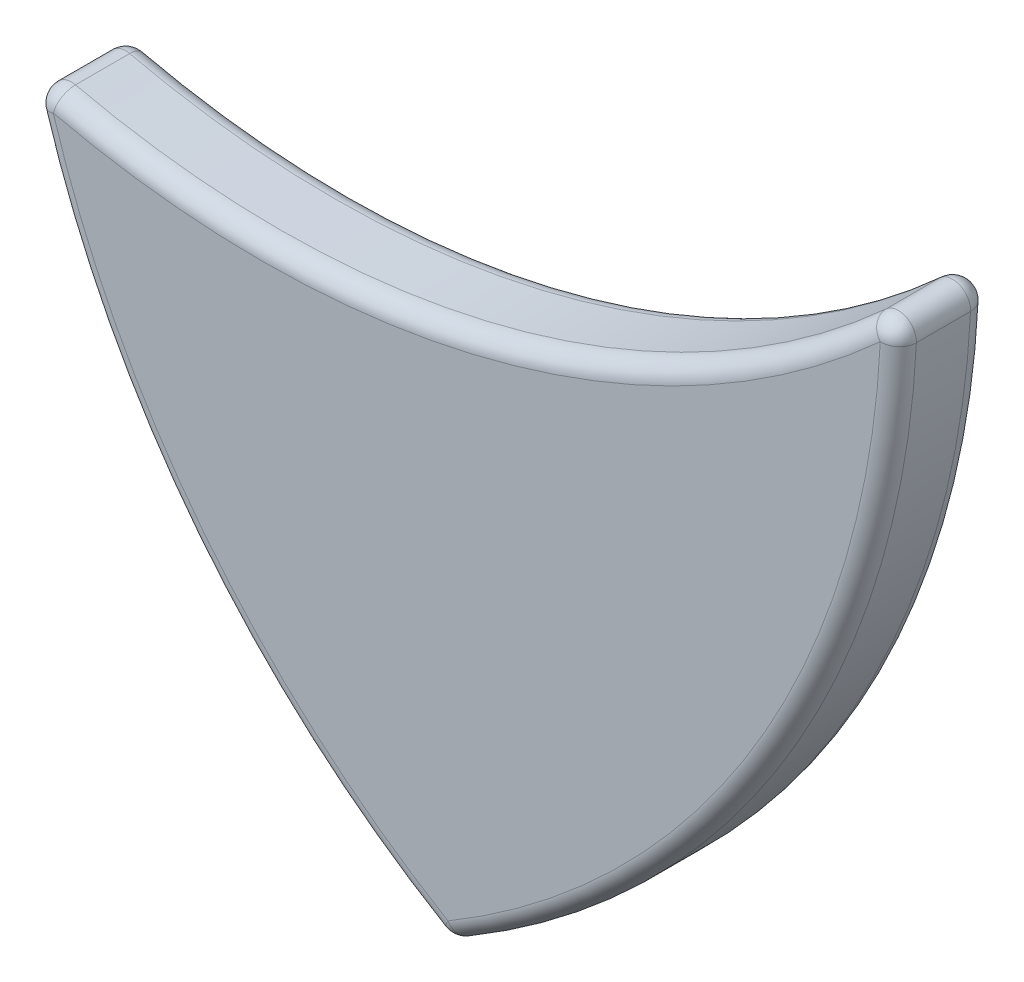
ISO-10303-21;
HEADER;
FILE_DESCRIPTION(('STEP AP214'),'2;1');
FILE_NAME('part.step','',(''),(''),'','','');
FILE_SCHEMA(('AUTOMOTIVE_DESIGN { 1 0 10303 214 1 1 1 1 }'));
ENDSEC;
DATA;
#1=APPLICATION_CONTEXT('core data for automotive mechanical design processes');
#2=APPLICATION_PROTOCOL_DEFINITION('international standard','automotive_design',2000,#1);
#3=PRODUCT_CONTEXT('',#1,'mechanical');
#4=PRODUCT('Part','Part','',(#3));
#5=PRODUCT_RELATED_PRODUCT_CATEGORY('part','',(#4));
#6=PRODUCT_DEFINITION_FORMATION('','',#4);
#7=PRODUCT_DEFINITION_CONTEXT('part definition',#1,'design');
#8=PRODUCT_DEFINITION('design','',#6,#7);
#9=PRODUCT_DEFINITION_SHAPE('','',#8);
#10=(LENGTH_UNIT() NAMED_UNIT(*) SI_UNIT(.MILLI.,.METRE.));
#11=(NAMED_UNIT(*) PLANE_ANGLE_UNIT() SI_UNIT($,.RADIAN.));
#12=(NAMED_UNIT(*) SI_UNIT($,.STERADIAN.) SOLID_ANGLE_UNIT());
#13=UNCERTAINTY_MEASURE_WITH_UNIT(LENGTH_MEASURE(1.E-05),#10,'distance_accuracy_value','');
#14=(GEOMETRIC_REPRESENTATION_CONTEXT(3) GLOBAL_UNCERTAINTY_ASSIGNED_CONTEXT((#13)) GLOBAL_UNIT_ASSIGNED_CONTEXT((#10,
#11,#12)) REPRESENTATION_CONTEXT('',''));
#15=CARTESIAN_POINT('',(0.,0.,0.));
#16=DIRECTION('',(0.,0.,1.));
#17=DIRECTION('',(1.,0.,0.));
#18=AXIS2_PLACEMENT_3D('',#15,#16,#17);
#19=CARTESIAN_POINT('',(-50.,0.,5.));
#20=DIRECTION('',(0.,0.,-1.));
#21=DIRECTION('',(-1.,0.,0.));
#22=AXIS2_PLACEMENT_3D('',#19,#20,#21);
#23=CYLINDRICAL_SURFACE('',#22,50.);
#24=DIRECTION('',(0.,0.,-1.));
#25=VECTOR('',#24,1.);
#26=CARTESIAN_POINT('',(-24.4897959183674,-43.0026683789908,5.));
#27=LINE('',#26,#25);
#28=CARTESIAN_POINT('',(-24.4897959183674,-43.0026683789908,4.));
#29=VERTEX_POINT('',#28);
#30=CARTESIAN_POINT('',(-24.4897959183674,-43.0026683789908,1.));
#31=VERTEX_POINT('',#30);
#32=EDGE_CURVE('E181',#29,#31,#27,.T.);
#33=ORIENTED_EDGE('',*,*,#32,.T.);
#34=CARTESIAN_POINT('',(-50.,0.,1.));
#35=DIRECTION('',(0.,0.,1.));
#36=DIRECTION('',(1.,0.,0.));
#37=AXIS2_PLACEMENT_3D('',#34,#35,#36);
#38=CIRCLE('',#37,50.);
#39=CARTESIAN_POINT('',(-0.0595144129420885,-2.43883154991504,1.));
#40=VERTEX_POINT('',#39);
#41=EDGE_CURVE('E184',#31,#40,#38,.T.);
#42=ORIENTED_EDGE('',*,*,#41,.T.);
#43=DIRECTION('',(0.,0.,-1.));
#44=VECTOR('',#43,1.);
#45=CARTESIAN_POINT('',(-0.0595144129420799,-2.43883154991504,5.));
#46=LINE('',#45,#44);
#47=CARTESIAN_POINT('',(-0.0595144129420885,-2.43883154991504,4.));
#48=VERTEX_POINT('',#47);
#49=EDGE_CURVE('E185',#40,#48,#46,.F.);
#50=ORIENTED_EDGE('',*,*,#49,.T.);
#51=CARTESIAN_POINT('',(-50.,0.,4.));
#52=DIRECTION('',(0.,0.,1.));
#53=DIRECTION('',(1.,0.,0.));
#54=AXIS2_PLACEMENT_3D('',#51,#52,#53);
#55=CIRCLE('',#54,50.);
#56=EDGE_CURVE('E174',#48,#29,#55,.F.);
#57=ORIENTED_EDGE('',*,*,#56,.T.);
#58=EDGE_LOOP('',(#33,#42,#50,#57));
#59=FACE_BOUND('',#58,.T.);
#60=ADVANCED_FACE('F37',(#59),#23,.T.);
#61=CARTESIAN_POINT('',(-35.3553390593375,35.3553390593173,5.));
#62=DIRECTION('',(0.,0.,-1.));
#63=DIRECTION('',(-1.,0.,0.));
#64=AXIS2_PLACEMENT_3D('',#61,#62,#63);
#65=CYLINDRICAL_SURFACE('',#64,50.);
#66=DIRECTION('',(0.,0.,-1.));
#67=VECTOR('',#66,1.);
#68=CARTESIAN_POINT('',(-1.73081461359804,-1.64994915463765,5.));
#69=LINE('',#68,#67);
#70=CARTESIAN_POINT('',(-1.73081461359804,-1.64994915463765,4.));
#71=VERTEX_POINT('',#70);
#72=CARTESIAN_POINT('',(-1.73081461359804,-1.64994915463765,1.));
#73=VERTEX_POINT('',#72);
#74=EDGE_CURVE('E116',#71,#73,#69,.T.);
#75=ORIENTED_EDGE('',*,*,#74,.T.);
#76=CARTESIAN_POINT('',(-35.3553390593375,35.3553390593173,1.));
#77=DIRECTION('',(0.,0.,1.));
#78=DIRECTION('',(1.,0.,0.));
#79=AXIS2_PLACEMENT_3D('',#76,#77,#78);
#80=CIRCLE('',#79,50.);
#81=CARTESIAN_POINT('',(-46.632039049049,-13.356425816758,1.));
#82=VERTEX_POINT('',#81);
#83=EDGE_CURVE('E112',#73,#82,#80,.F.);
#84=ORIENTED_EDGE('',*,*,#83,.T.);
#85=DIRECTION('',(0.,0.,-1.));
#86=VECTOR('',#85,1.);
#87=CARTESIAN_POINT('',(-46.632039049049,-13.356425816758,5.));
#88=LINE('',#87,#86);
#89=CARTESIAN_POINT('',(-46.632039049049,-13.356425816758,4.));
#90=VERTEX_POINT('',#89);
#91=EDGE_CURVE('E106',#82,#90,#88,.F.);
#92=ORIENTED_EDGE('',*,*,#91,.T.);
#93=CARTESIAN_POINT('',(-35.3553390593375,35.3553390593173,4.));
#94=DIRECTION('',(0.,0.,1.));
#95=DIRECTION('',(1.,0.,0.));
#96=AXIS2_PLACEMENT_3D('',#93,#94,#95);
#97=CIRCLE('',#96,50.);
#98=EDGE_CURVE('E109',#90,#71,#97,.T.);
#99=ORIENTED_EDGE('',*,*,#98,.T.);
#100=EDGE_LOOP('',(#75,#84,#92,#99));
#101=FACE_BOUND('',#100,.T.);
#102=ADVANCED_FACE('F108',(#101),#65,.F.);
#103=CARTESIAN_POINT('',(0.,0.,5.));
#104=DIRECTION('',(0.,0.,-1.));
#105=DIRECTION('',(-1.,0.,0.));
#106=AXIS2_PLACEMENT_3D('',#103,#104,#105);
#107=CYLINDRICAL_SURFACE('',#106,50.);
#108=CARTESIAN_POINT('',(0.,0.,4.));
#109=DIRECTION('',(0.,0.,1.));
#110=DIRECTION('',(1.,0.,0.));
#111=AXIS2_PLACEMENT_3D('',#108,#109,#110);
#112=CIRCLE('',#111,50.);
#113=CARTESIAN_POINT('',(-25.5102040816327,-43.0026683789908,4.));
#114=VERTEX_POINT('',#113);
#115=CARTESIAN_POINT('',(-47.81385004984,-14.6231235859995,4.));
#116=VERTEX_POINT('',#115);
#117=EDGE_CURVE('E227',#114,#116,#112,.F.);
#118=ORIENTED_EDGE('',*,*,#117,.T.);
#119=DIRECTION('',(0.,0.,-1.));
#120=VECTOR('',#119,1.);
#121=CARTESIAN_POINT('',(-47.8138500498401,-14.6231235859995,5.));
#122=LINE('',#121,#120);
#123=CARTESIAN_POINT('',(-47.81385004984,-14.6231235859995,1.));
#124=VERTEX_POINT('',#123);
#125=EDGE_CURVE('E138',#116,#124,#122,.T.);
#126=ORIENTED_EDGE('',*,*,#125,.T.);
#127=CARTESIAN_POINT('',(0.,0.,1.));
#128=DIRECTION('',(0.,0.,1.));
#129=DIRECTION('',(1.,0.,0.));
#130=AXIS2_PLACEMENT_3D('',#127,#128,#129);
#131=CIRCLE('',#130,50.);
#132=CARTESIAN_POINT('',(-25.5102040816327,-43.0026683789908,1.));
#133=VERTEX_POINT('',#132);
#134=EDGE_CURVE('E234',#124,#133,#131,.T.);
#135=ORIENTED_EDGE('',*,*,#134,.T.);
#136=DIRECTION('',(0.,0.,-1.));
#137=VECTOR('',#136,1.);
#138=CARTESIAN_POINT('',(-25.5102040816327,-43.0026683789908,5.));
#139=LINE('',#138,#137);
#140=EDGE_CURVE('E229',#133,#114,#139,.F.);
#141=ORIENTED_EDGE('',*,*,#140,.T.);
#142=EDGE_LOOP('',(#118,#126,#135,#141));
#143=FACE_BOUND('',#142,.T.);
#144=ADVANCED_FACE('F257',(#143),#107,.T.);
#145=CARTESIAN_POINT('',(-42.6776695296688,17.6776695296586,5.));
#146=DIRECTION('',(0.,0.,1.));
#147=DIRECTION('',(1.,0.,0.));
#148=AXIS2_PLACEMENT_3D('',#145,#146,#147);
#149=PLANE('',#148);
#150=CARTESIAN_POINT('',(-35.3553390593375,35.3553390593173,5.));
#151=DIRECTION('',(0.,0.,1.));
#152=DIRECTION('',(1.,0.,0.));
#153=AXIS2_PLACEMENT_3D('',#150,#151,#152);
#154=CIRCLE('',#153,51.);
#155=CARTESIAN_POINT('',(-1.05832412468324,-2.39005491891674,5.));
#156=VERTEX_POINT('',#155);
#157=CARTESIAN_POINT('',(-46.8575730488433,-14.3306611142795,5.));
#158=VERTEX_POINT('',#157);
#159=EDGE_CURVE('E46',#156,#158,#154,.F.);
#160=ORIENTED_EDGE('',*,*,#159,.T.);
#161=CARTESIAN_POINT('',(0.,0.,5.));
#162=DIRECTION('',(0.,0.,1.));
#163=DIRECTION('',(1.,0.,0.));
#164=AXIS2_PLACEMENT_3D('',#161,#162,#163);
#165=CIRCLE('',#164,49.);
#166=CARTESIAN_POINT('',(-25.,-42.142615011411,5.));
#167=VERTEX_POINT('',#166);
#168=EDGE_CURVE('E11',#158,#167,#165,.T.);
#169=ORIENTED_EDGE('',*,*,#168,.T.);
#170=CARTESIAN_POINT('',(-50.,0.,5.));
#171=DIRECTION('',(0.,0.,1.));
#172=DIRECTION('',(1.,0.,0.));
#173=AXIS2_PLACEMENT_3D('',#170,#171,#172);
#174=CIRCLE('',#173,49.);
#175=EDGE_CURVE('E56',#167,#156,#174,.T.);
#176=ORIENTED_EDGE('',*,*,#175,.T.);
#177=EDGE_LOOP('',(#160,#169,#176));
#178=FACE_BOUND('',#177,.T.);
#179=ADVANCED_FACE('F288',(#178),#149,.T.);
#180=CARTESIAN_POINT('',(-42.6776695296688,17.6776695296586,0.));
#181=DIRECTION('',(0.,0.,1.));
#182=DIRECTION('',(1.,0.,0.));
#183=AXIS2_PLACEMENT_3D('',#180,#181,#182);
#184=PLANE('',#183);
#185=CARTESIAN_POINT('',(0.,0.,0.));
#186=DIRECTION('',(0.,0.,1.));
#187=DIRECTION('',(1.,0.,0.));
#188=AXIS2_PLACEMENT_3D('',#185,#186,#187);
#189=CIRCLE('',#188,49.);
#190=CARTESIAN_POINT('',(-25.,-42.142615011411,0.));
#191=VERTEX_POINT('',#190);
#192=CARTESIAN_POINT('',(-46.8575730488433,-14.3306611142795,0.));
#193=VERTEX_POINT('',#192);
#194=EDGE_CURVE('E218',#191,#193,#189,.F.);
#195=ORIENTED_EDGE('',*,*,#194,.T.);
#196=CARTESIAN_POINT('',(-35.3553390593375,35.3553390593173,0.));
#197=DIRECTION('',(0.,0.,1.));
#198=DIRECTION('',(1.,0.,0.));
#199=AXIS2_PLACEMENT_3D('',#196,#197,#198);
#200=CIRCLE('',#199,51.);
#201=CARTESIAN_POINT('',(-1.05832412468324,-2.39005491891674,0.));
#202=VERTEX_POINT('',#201);
#203=EDGE_CURVE('E221',#193,#202,#200,.T.);
#204=ORIENTED_EDGE('',*,*,#203,.T.);
#205=CARTESIAN_POINT('',(-50.,0.,0.));
#206=DIRECTION('',(0.,0.,1.));
#207=DIRECTION('',(1.,0.,0.));
#208=AXIS2_PLACEMENT_3D('',#205,#206,#207);
#209=CIRCLE('',#208,49.);
#210=EDGE_CURVE('E212',#202,#191,#209,.F.);
#211=ORIENTED_EDGE('',*,*,#210,.T.);
#212=EDGE_LOOP('',(#195,#204,#211));
#213=FACE_BOUND('',#212,.T.);
#214=ADVANCED_FACE('F222',(#213),#184,.F.);
#215=CARTESIAN_POINT('',(-25.,-42.142615011411,4.));
#216=DIRECTION('',(0.,0.,1.));
#217=DIRECTION('',(1.,0.,0.));
#218=AXIS2_PLACEMENT_3D('',#215,#216,#217);
#219=SPHERICAL_SURFACE('',#218,1.);
#220=CARTESIAN_POINT('',(-25.,-42.142615011411,4.));
#221=DIRECTION('',(0.,0.,1.));
#222=DIRECTION('',(1.,0.,0.));
#223=AXIS2_PLACEMENT_3D('',#220,#221,#222);
#224=CIRCLE('',#223,1.);
#225=EDGE_CURVE('E160',#29,#114,#224,.F.);
#226=ORIENTED_EDGE('',*,*,#225,.F.);
#227=CARTESIAN_POINT('',(-25.,-42.142615011411,4.));
#228=DIRECTION('',(-0.860053367579815,-0.510204081632653,0.));
#229=DIRECTION('',(0.510204081632653,-0.860053367579815,0.));
#230=AXIS2_PLACEMENT_3D('',#227,#228,#229);
#231=CIRCLE('',#230,1.);
#232=EDGE_CURVE('E41',#167,#29,#231,.F.);
#233=ORIENTED_EDGE('',*,*,#232,.F.);
#234=CARTESIAN_POINT('',(-25.,-42.142615011411,4.));
#235=DIRECTION('',(0.860053367579815,-0.510204081632653,0.));
#236=DIRECTION('',(0.510204081632653,0.860053367579815,0.));
#237=AXIS2_PLACEMENT_3D('',#234,#235,#236);
#238=CIRCLE('',#237,1.);
#239=EDGE_CURVE('E162',#114,#167,#238,.F.);
#240=ORIENTED_EDGE('',*,*,#239,.F.);
#241=EDGE_LOOP('',(#226,#233,#240));
#242=FACE_BOUND('',#241,.T.);
#243=ADVANCED_FACE('F39',(#242),#219,.T.);
#244=CARTESIAN_POINT('',(-50.,0.,4.));
#245=DIRECTION('',(0.,0.,1.));
#246=DIRECTION('',(1.,0.,0.));
#247=AXIS2_PLACEMENT_3D('',#244,#245,#246);
#248=TOROIDAL_SURFACE('',#247,49.,1.);
#249=ORIENTED_EDGE('',*,*,#232,.T.);
#250=ORIENTED_EDGE('',*,*,#56,.F.);
#251=CARTESIAN_POINT('',(-1.05832412468324,-2.39005491891674,4.));
#252=DIRECTION('',(0.0487766309983015,0.998809711741158,0.));
#253=DIRECTION('',(-0.998809711741158,0.0487766309983015,0.));
#254=AXIS2_PLACEMENT_3D('',#251,#252,#253);
#255=CIRCLE('',#254,1.);
#256=EDGE_CURVE('E157',#156,#48,#255,.T.);
#257=ORIENTED_EDGE('',*,*,#256,.F.);
#258=ORIENTED_EDGE('',*,*,#175,.F.);
#259=EDGE_LOOP('',(#249,#250,#257,#258));
#260=FACE_BOUND('',#259,.T.);
#261=ADVANCED_FACE('F172',(#260),#248,.T.);
#262=CARTESIAN_POINT('',(-35.3553390593375,35.3553390593173,4.));
#263=DIRECTION('',(0.,0.,1.));
#264=DIRECTION('',(1.,0.,0.));
#265=AXIS2_PLACEMENT_3D('',#262,#263,#264);
#266=TOROIDAL_SURFACE('',#265,51.,1.);
#267=CARTESIAN_POINT('',(-46.8575730488433,-14.3306611142795,4.));
#268=DIRECTION('',(-0.974235297521503,0.22553399979424,0.));
#269=DIRECTION('',(-0.22553399979424,-0.974235297521503,0.));
#270=AXIS2_PLACEMENT_3D('',#267,#268,#269);
#271=CIRCLE('',#270,1.);
#272=EDGE_CURVE('E122',#158,#90,#271,.T.);
#273=ORIENTED_EDGE('',*,*,#272,.F.);
#274=ORIENTED_EDGE('',*,*,#159,.F.);
#275=CARTESIAN_POINT('',(-1.05832412468326,-2.39005491891674,4.));
#276=DIRECTION('',(0.740105764279098,0.672490488914789,0.));
#277=DIRECTION('',(-0.672490488914789,0.740105764279098,0.));
#278=AXIS2_PLACEMENT_3D('',#275,#276,#277);
#279=CIRCLE('',#278,1.);
#280=EDGE_CURVE('E125',#71,#156,#279,.T.);
#281=ORIENTED_EDGE('',*,*,#280,.F.);
#282=ORIENTED_EDGE('',*,*,#98,.F.);
#283=EDGE_LOOP('',(#273,#274,#281,#282));
#284=FACE_BOUND('',#283,.T.);
#285=ADVANCED_FACE('F121',(#284),#266,.T.);
#286=CARTESIAN_POINT('',(0.,0.,4.));
#287=DIRECTION('',(0.,0.,1.));
#288=DIRECTION('',(1.,0.,0.));
#289=AXIS2_PLACEMENT_3D('',#286,#287,#288);
#290=TOROIDAL_SURFACE('',#289,49.,1.);
#291=ORIENTED_EDGE('',*,*,#239,.T.);
#292=ORIENTED_EDGE('',*,*,#168,.F.);
#293=CARTESIAN_POINT('',(-46.8575730488432,-14.3306611142795,4.));
#294=DIRECTION('',(-0.29246247171999,0.9562770009968,0.));
#295=DIRECTION('',(-0.9562770009968,-0.29246247171999,0.));
#296=AXIS2_PLACEMENT_3D('',#293,#294,#295);
#297=CIRCLE('',#296,1.);
#298=EDGE_CURVE('E134',#116,#158,#297,.T.);
#299=ORIENTED_EDGE('',*,*,#298,.F.);
#300=ORIENTED_EDGE('',*,*,#117,.F.);
#301=EDGE_LOOP('',(#291,#292,#299,#300));
#302=FACE_BOUND('',#301,.T.);
#303=ADVANCED_FACE('F250',(#302),#290,.T.);
#304=CARTESIAN_POINT('',(-25.,-42.142615011411,5.));
#305=DIRECTION('',(0.,0.,-1.));
#306=DIRECTION('',(-1.,0.,0.));
#307=AXIS2_PLACEMENT_3D('',#304,#305,#306);
#308=CYLINDRICAL_SURFACE('',#307,1.);
#309=ORIENTED_EDGE('',*,*,#225,.T.);
#310=ORIENTED_EDGE('',*,*,#140,.F.);
#311=CARTESIAN_POINT('',(-25.,-42.142615011411,1.));
#312=DIRECTION('',(0.,0.,-1.));
#313=DIRECTION('',(-1.,0.,0.));
#314=AXIS2_PLACEMENT_3D('',#311,#312,#313);
#315=CIRCLE('',#314,1.);
#316=EDGE_CURVE('E152',#31,#133,#315,.T.);
#317=ORIENTED_EDGE('',*,*,#316,.F.);
#318=ORIENTED_EDGE('',*,*,#32,.F.);
#319=EDGE_LOOP('',(#309,#310,#317,#318));
#320=FACE_BOUND('',#319,.T.);
#321=ADVANCED_FACE('F182',(#320),#308,.T.);
#322=CARTESIAN_POINT('',(-1.05832412468325,-2.39005491891675,4.));
#323=DIRECTION('',(0.,0.,1.));
#324=DIRECTION('',(0.,-1.,0.));
#325=AXIS2_PLACEMENT_3D('',#322,#323,#324);
#326=SPHERICAL_SURFACE('',#325,1.);
#327=ORIENTED_EDGE('',*,*,#280,.T.);
#328=ORIENTED_EDGE('',*,*,#256,.T.);
#329=CARTESIAN_POINT('',(-1.05832412468325,-2.39005491891674,4.));
#330=DIRECTION('',(0.,0.,1.));
#331=DIRECTION('',(1.,0.,0.));
#332=AXIS2_PLACEMENT_3D('',#329,#330,#331);
#333=CIRCLE('',#332,1.);
#334=EDGE_CURVE('E139',#71,#48,#333,.F.);
#335=ORIENTED_EDGE('',*,*,#334,.F.);
#336=EDGE_LOOP('',(#327,#328,#335));
#337=FACE_BOUND('',#336,.T.);
#338=ADVANCED_FACE('F241',(#337),#326,.T.);
#339=CARTESIAN_POINT('',(-46.8575730488432,-14.3306611142795,4.));
#340=DIRECTION('',(0.,0.,1.));
#341=DIRECTION('',(1.,0.,0.));
#342=AXIS2_PLACEMENT_3D('',#339,#340,#341);
#343=SPHERICAL_SURFACE('',#342,1.);
#344=ORIENTED_EDGE('',*,*,#298,.T.);
#345=ORIENTED_EDGE('',*,*,#272,.T.);
#346=CARTESIAN_POINT('',(-46.8575730488432,-14.3306611142795,4.));
#347=DIRECTION('',(0.,0.,1.));
#348=DIRECTION('',(1.,0.,0.));
#349=AXIS2_PLACEMENT_3D('',#346,#347,#348);
#350=CIRCLE('',#349,1.);
#351=EDGE_CURVE('E131',#116,#90,#350,.F.);
#352=ORIENTED_EDGE('',*,*,#351,.F.);
#353=EDGE_LOOP('',(#344,#345,#352));
#354=FACE_BOUND('',#353,.T.);
#355=ADVANCED_FACE('F130',(#354),#343,.T.);
#356=CARTESIAN_POINT('',(-25.,-42.142615011411,1.));
#357=DIRECTION('',(0.,0.,-1.));
#358=DIRECTION('',(-1.,0.,0.));
#359=AXIS2_PLACEMENT_3D('',#356,#357,#358);
#360=SPHERICAL_SURFACE('',#359,1.);
#361=CARTESIAN_POINT('',(-25.,-42.142615011411,1.));
#362=DIRECTION('',(0.860053367579815,-0.510204081632653,0.));
#363=DIRECTION('',(0.510204081632653,0.860053367579815,0.));
#364=AXIS2_PLACEMENT_3D('',#361,#362,#363);
#365=CIRCLE('',#364,1.);
#366=EDGE_CURVE('E140',#191,#133,#365,.F.);
#367=ORIENTED_EDGE('',*,*,#366,.F.);
#368=CARTESIAN_POINT('',(-25.,-42.142615011411,1.));
#369=DIRECTION('',(-0.860053367579815,-0.510204081632653,0.));
#370=DIRECTION('',(0.510204081632653,-0.860053367579815,0.));
#371=AXIS2_PLACEMENT_3D('',#368,#369,#370);
#372=CIRCLE('',#371,1.);
#373=EDGE_CURVE('E143',#31,#191,#372,.F.);
#374=ORIENTED_EDGE('',*,*,#373,.F.);
#375=ORIENTED_EDGE('',*,*,#316,.T.);
#376=EDGE_LOOP('',(#367,#374,#375));
#377=FACE_BOUND('',#376,.T.);
#378=ADVANCED_FACE('F248',(#377),#360,.T.);
#379=CARTESIAN_POINT('',(-50.,0.,1.));
#380=DIRECTION('',(0.,0.,1.));
#381=DIRECTION('',(1.,0.,0.));
#382=AXIS2_PLACEMENT_3D('',#379,#380,#381);
#383=TOROIDAL_SURFACE('',#382,49.,1.);
#384=ORIENTED_EDGE('',*,*,#373,.T.);
#385=ORIENTED_EDGE('',*,*,#210,.F.);
#386=CARTESIAN_POINT('',(-1.05832412468325,-2.39005491891674,1.));
#387=DIRECTION('',(0.0487766309983009,0.998809711741158,0.));
#388=DIRECTION('',(-0.998809711741158,0.0487766309983009,0.));
#389=AXIS2_PLACEMENT_3D('',#386,#387,#388);
#390=CIRCLE('',#389,1.);
#391=EDGE_CURVE('E146',#40,#202,#390,.T.);
#392=ORIENTED_EDGE('',*,*,#391,.F.);
#393=ORIENTED_EDGE('',*,*,#41,.F.);
#394=EDGE_LOOP('',(#384,#385,#392,#393));
#395=FACE_BOUND('',#394,.T.);
#396=ADVANCED_FACE('F214',(#395),#383,.T.);
#397=CARTESIAN_POINT('',(-1.05832412468326,-2.39005491891674,5.));
#398=DIRECTION('',(0.,0.,1.));
#399=DIRECTION('',(1.,0.,0.));
#400=AXIS2_PLACEMENT_3D('',#397,#398,#399);
#401=CYLINDRICAL_SURFACE('',#400,1.);
#402=ORIENTED_EDGE('',*,*,#334,.T.);
#403=ORIENTED_EDGE('',*,*,#49,.F.);
#404=CARTESIAN_POINT('',(-1.05832412468326,-2.39005491891674,1.));
#405=DIRECTION('',(0.,0.,-1.));
#406=DIRECTION('',(-1.,0.,0.));
#407=AXIS2_PLACEMENT_3D('',#404,#405,#406);
#408=CIRCLE('',#407,1.);
#409=EDGE_CURVE('E202',#73,#40,#408,.T.);
#410=ORIENTED_EDGE('',*,*,#409,.F.);
#411=ORIENTED_EDGE('',*,*,#74,.F.);
#412=EDGE_LOOP('',(#402,#403,#410,#411));
#413=FACE_BOUND('',#412,.T.);
#414=ADVANCED_FACE('F238',(#413),#401,.T.);
#415=CARTESIAN_POINT('',(-46.8575730488432,-14.3306611142795,5.));
#416=DIRECTION('',(0.,0.,1.));
#417=DIRECTION('',(1.,0.,0.));
#418=AXIS2_PLACEMENT_3D('',#415,#416,#417);
#419=CYLINDRICAL_SURFACE('',#418,1.);
#420=ORIENTED_EDGE('',*,*,#351,.T.);
#421=ORIENTED_EDGE('',*,*,#91,.F.);
#422=CARTESIAN_POINT('',(-46.8575730488432,-14.3306611142795,1.));
#423=DIRECTION('',(0.,0.,-1.));
#424=DIRECTION('',(-1.,0.,0.));
#425=AXIS2_PLACEMENT_3D('',#422,#423,#424);
#426=CIRCLE('',#425,1.);
#427=EDGE_CURVE('E199',#124,#82,#426,.T.);
#428=ORIENTED_EDGE('',*,*,#427,.F.);
#429=ORIENTED_EDGE('',*,*,#125,.F.);
#430=EDGE_LOOP('',(#420,#421,#428,#429));
#431=FACE_BOUND('',#430,.T.);
#432=ADVANCED_FACE('F136',(#431),#419,.T.);
#433=CARTESIAN_POINT('',(0.,0.,1.));
#434=DIRECTION('',(0.,0.,1.));
#435=DIRECTION('',(1.,0.,0.));
#436=AXIS2_PLACEMENT_3D('',#433,#434,#435);
#437=TOROIDAL_SURFACE('',#436,49.,1.);
#438=ORIENTED_EDGE('',*,*,#366,.T.);
#439=ORIENTED_EDGE('',*,*,#134,.F.);
#440=CARTESIAN_POINT('',(-46.8575730488433,-14.3306611142795,1.));
#441=DIRECTION('',(-0.292462471720014,0.956277000996793,0.));
#442=DIRECTION('',(-0.956277000996793,-0.292462471720014,0.));
#443=AXIS2_PLACEMENT_3D('',#440,#441,#442);
#444=CIRCLE('',#443,1.);
#445=EDGE_CURVE('E197',#193,#124,#444,.T.);
#446=ORIENTED_EDGE('',*,*,#445,.F.);
#447=ORIENTED_EDGE('',*,*,#194,.F.);
#448=EDGE_LOOP('',(#438,#439,#446,#447));
#449=FACE_BOUND('',#448,.T.);
#450=ADVANCED_FACE('F270',(#449),#437,.T.);
#451=CARTESIAN_POINT('',(-1.05832412468325,-2.39005491891675,1.));
#452=DIRECTION('',(0.,0.,-1.));
#453=DIRECTION('',(0.,1.,0.));
#454=AXIS2_PLACEMENT_3D('',#451,#452,#453);
#455=SPHERICAL_SURFACE('',#454,1.);
#456=ORIENTED_EDGE('',*,*,#409,.T.);
#457=ORIENTED_EDGE('',*,*,#391,.T.);
#458=CARTESIAN_POINT('',(-1.05832412468324,-2.39005491891674,1.));
#459=DIRECTION('',(0.74010576427909,0.672490488914798,0.));
#460=DIRECTION('',(-0.672490488914798,0.74010576427909,0.));
#461=AXIS2_PLACEMENT_3D('',#458,#459,#460);
#462=CIRCLE('',#461,1.);
#463=EDGE_CURVE('E195',#73,#202,#462,.F.);
#464=ORIENTED_EDGE('',*,*,#463,.F.);
#465=EDGE_LOOP('',(#456,#457,#464));
#466=FACE_BOUND('',#465,.T.);
#467=ADVANCED_FACE('F209',(#466),#455,.T.);
#468=CARTESIAN_POINT('',(-46.8575730488432,-14.3306611142795,1.));
#469=DIRECTION('',(0.,0.,-1.));
#470=DIRECTION('',(-1.,0.,0.));
#471=AXIS2_PLACEMENT_3D('',#468,#469,#470);
#472=SPHERICAL_SURFACE('',#471,1.);
#473=ORIENTED_EDGE('',*,*,#445,.T.);
#474=ORIENTED_EDGE('',*,*,#427,.T.);
#475=CARTESIAN_POINT('',(-46.8575730488432,-14.3306611142795,1.));
#476=DIRECTION('',(-0.974235297521506,0.225533999794227,0.));
#477=DIRECTION('',(-0.225533999794227,-0.974235297521506,0.));
#478=AXIS2_PLACEMENT_3D('',#475,#476,#477);
#479=CIRCLE('',#478,1.);
#480=EDGE_CURVE('E193',#193,#82,#479,.F.);
#481=ORIENTED_EDGE('',*,*,#480,.F.);
#482=EDGE_LOOP('',(#473,#474,#481));
#483=FACE_BOUND('',#482,.T.);
#484=ADVANCED_FACE('F264',(#483),#472,.T.);
#485=CARTESIAN_POINT('',(-35.3553390593375,35.3553390593173,1.));
#486=DIRECTION('',(0.,0.,1.));
#487=DIRECTION('',(1.,0.,0.));
#488=AXIS2_PLACEMENT_3D('',#485,#486,#487);
#489=TOROIDAL_SURFACE('',#488,51.,1.);
#490=ORIENTED_EDGE('',*,*,#463,.T.);
#491=ORIENTED_EDGE('',*,*,#203,.F.);
#492=ORIENTED_EDGE('',*,*,#480,.T.);
#493=ORIENTED_EDGE('',*,*,#83,.F.);
#494=EDGE_LOOP('',(#490,#491,#492,#493));
#495=FACE_BOUND('',#494,.T.);
#496=ADVANCED_FACE('F261',(#495),#489,.T.);
#497=CLOSED_SHELL('',(#60,#102,#144,#179,#214,#243,#261,#285,#303,#321,#338,#355,#378,#396,#414,
#432,#450,#467,#484,#496));
#498=MANIFOLD_SOLID_BREP('B2',#497);
#499=ADVANCED_BREP_SHAPE_REPRESENTATION('',(#18,#498),#14);
#500=SHAPE_DEFINITION_REPRESENTATION(#9,#499);
ENDSEC;
END-ISO-10303-21;
